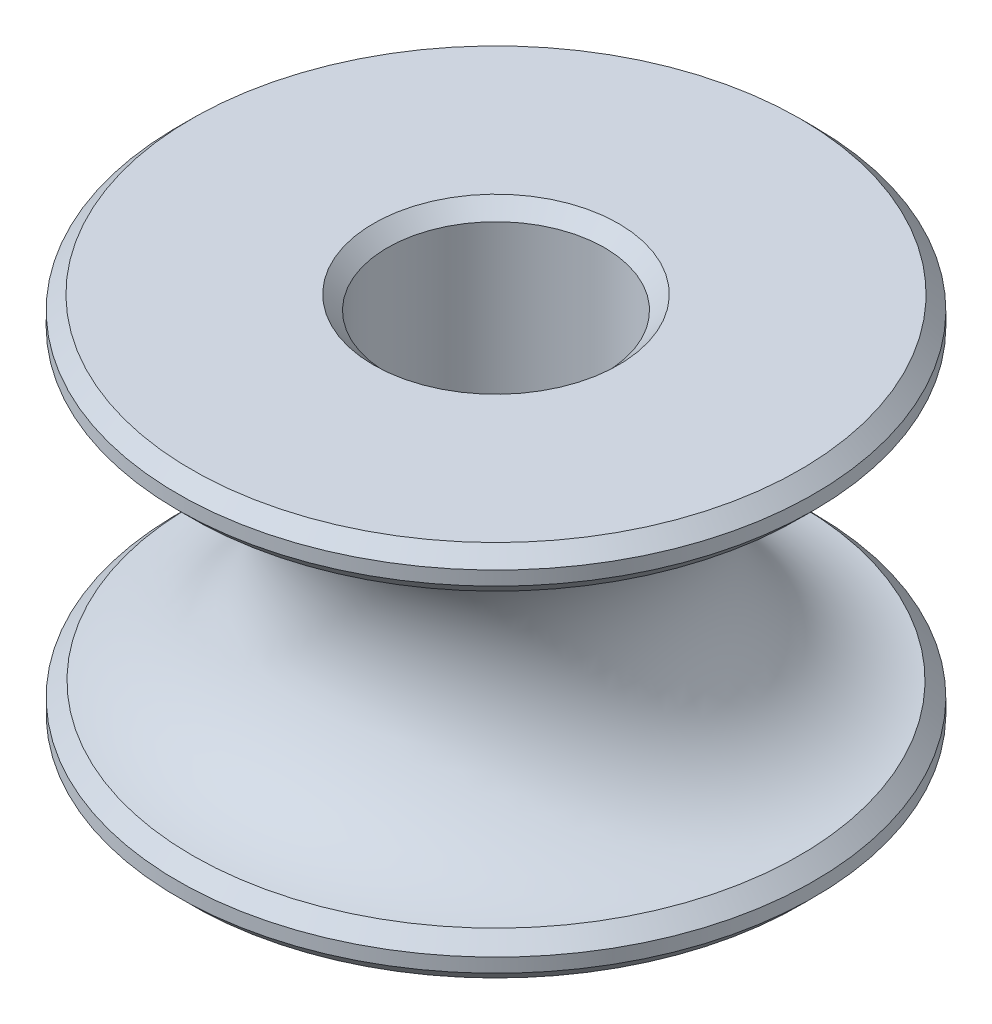
ISO-10303-21;
HEADER;
FILE_DESCRIPTION(('STEP AP214'),'2;1');
FILE_NAME('part.step','',(''),(''),'','','');
FILE_SCHEMA(('AUTOMOTIVE_DESIGN { 1 0 10303 214 1 1 1 1 }'));
ENDSEC;
DATA;
#1=APPLICATION_CONTEXT('core data for automotive mechanical design processes');
#2=APPLICATION_PROTOCOL_DEFINITION('international standard','automotive_design',2000,#1);
#3=PRODUCT_CONTEXT('',#1,'mechanical');
#4=PRODUCT('Part','Part','',(#3));
#5=PRODUCT_RELATED_PRODUCT_CATEGORY('part','',(#4));
#6=PRODUCT_DEFINITION_FORMATION('','',#4);
#7=PRODUCT_DEFINITION_CONTEXT('part definition',#1,'design');
#8=PRODUCT_DEFINITION('design','',#6,#7);
#9=PRODUCT_DEFINITION_SHAPE('','',#8);
#10=(LENGTH_UNIT() NAMED_UNIT(*) SI_UNIT(.MILLI.,.METRE.));
#11=(NAMED_UNIT(*) PLANE_ANGLE_UNIT() SI_UNIT($,.RADIAN.));
#12=(NAMED_UNIT(*) SI_UNIT($,.STERADIAN.) SOLID_ANGLE_UNIT());
#13=UNCERTAINTY_MEASURE_WITH_UNIT(LENGTH_MEASURE(1.E-05),#10,'distance_accuracy_value','');
#14=(GEOMETRIC_REPRESENTATION_CONTEXT(3) GLOBAL_UNCERTAINTY_ASSIGNED_CONTEXT((#13)) GLOBAL_UNIT_ASSIGNED_CONTEXT((#10,
#11,#12)) REPRESENTATION_CONTEXT('',''));
#15=CARTESIAN_POINT('',(0.,0.,0.));
#16=DIRECTION('',(0.,0.,1.));
#17=DIRECTION('',(1.,0.,0.));
#18=AXIS2_PLACEMENT_3D('',#15,#16,#17);
#19=CARTESIAN_POINT('',(0.,13.5,0.));
#20=DIRECTION('',(0.,-1.,0.));
#21=DIRECTION('',(0.,0.,-1.));
#22=AXIS2_PLACEMENT_3D('',#19,#20,#21);
#23=TOROIDAL_SURFACE('',#22,22.775,10.5);
#24=CARTESIAN_POINT('',(0.,3.05292644298629,0.));
#25=DIRECTION('',(0.,1.,0.));
#26=DIRECTION('',(0.,0.,1.));
#27=AXIS2_PLACEMENT_3D('',#24,#25,#26);
#28=CIRCLE('',#27,21.722073557014);
#29=CARTESIAN_POINT('',(0.,3.05292644298629,21.722073557014));
#30=VERTEX_POINT('',#29);
#31=EDGE_CURVE('E55',#30,#30,#28,.T.);
#32=ORIENTED_EDGE('',*,*,#31,.T.);
#33=EDGE_LOOP('',(#32));
#34=FACE_BOUND('',#33,.T.);
#35=CARTESIAN_POINT('',(0.,23.9470735570148,0.));
#36=DIRECTION('',(0.,-1.,0.));
#37=DIRECTION('',(0.,0.,-1.));
#38=AXIS2_PLACEMENT_3D('',#35,#36,#37);
#39=CIRCLE('',#38,21.7220735570139);
#40=CARTESIAN_POINT('',(0.,23.9470735570148,-21.7220735570139));
#41=VERTEX_POINT('',#40);
#42=EDGE_CURVE('E60',#41,#41,#39,.T.);
#43=ORIENTED_EDGE('',*,*,#42,.T.);
#44=EDGE_LOOP('',(#43));
#45=FACE_BOUND('',#44,.T.);
#46=ADVANCED_FACE('F41',(#34,#45),#23,.F.);
#47=CARTESIAN_POINT('',(0.,0.,0.));
#48=DIRECTION('',(0.,-1.,0.));
#49=DIRECTION('',(0.,0.,-1.));
#50=AXIS2_PLACEMENT_3D('',#47,#48,#49);
#51=CYLINDRICAL_SURFACE('',#50,22.775);
#52=CARTESIAN_POINT('',(0.,25.,0.));
#53=DIRECTION('',(0.,1.,0.));
#54=DIRECTION('',(0.,0.,1.));
#55=AXIS2_PLACEMENT_3D('',#52,#53,#54);
#56=CIRCLE('',#55,22.775);
#57=CARTESIAN_POINT('',(0.,25.,22.775));
#58=VERTEX_POINT('',#57);
#59=EDGE_CURVE('E10',#58,#58,#56,.T.);
#60=ORIENTED_EDGE('',*,*,#59,.T.);
#61=EDGE_LOOP('',(#60));
#62=FACE_BOUND('',#61,.T.);
#63=CARTESIAN_POINT('',(0.,26.,0.));
#64=DIRECTION('',(0.,-1.,0.));
#65=DIRECTION('',(0.,0.,-1.));
#66=AXIS2_PLACEMENT_3D('',#63,#64,#65);
#67=CIRCLE('',#66,22.775);
#68=CARTESIAN_POINT('',(0.,26.,-22.775));
#69=VERTEX_POINT('',#68);
#70=EDGE_CURVE('E50',#69,#69,#67,.T.);
#71=ORIENTED_EDGE('',*,*,#70,.T.);
#72=EDGE_LOOP('',(#71));
#73=FACE_BOUND('',#72,.T.);
#74=ADVANCED_FACE('F110',(#62,#73),#51,.T.);
#75=CARTESIAN_POINT('',(0.,27.,0.));
#76=DIRECTION('',(0.,-1.,0.));
#77=DIRECTION('',(0.,0.,-1.));
#78=AXIS2_PLACEMENT_3D('',#75,#76,#77);
#79=PLANE('',#78);
#80=CARTESIAN_POINT('',(0.,27.,0.));
#81=DIRECTION('',(0.,-1.,0.));
#82=DIRECTION('',(0.,0.,-1.));
#83=AXIS2_PLACEMENT_3D('',#80,#81,#82);
#84=CIRCLE('',#83,8.775);
#85=CARTESIAN_POINT('',(0.,27.,-8.775));
#86=VERTEX_POINT('',#85);
#87=EDGE_CURVE('E90',#86,#86,#84,.T.);
#88=ORIENTED_EDGE('',*,*,#87,.T.);
#89=EDGE_LOOP('',(#88));
#90=FACE_BOUND('',#89,.T.);
#91=CARTESIAN_POINT('',(0.,27.,0.));
#92=DIRECTION('',(0.,-1.,0.));
#93=DIRECTION('',(0.,0.,-1.));
#94=AXIS2_PLACEMENT_3D('',#91,#92,#93);
#95=CIRCLE('',#94,21.775);
#96=CARTESIAN_POINT('',(0.,27.,-21.775));
#97=VERTEX_POINT('',#96);
#98=EDGE_CURVE('E94',#97,#97,#95,.F.);
#99=ORIENTED_EDGE('',*,*,#98,.T.);
#100=EDGE_LOOP('',(#99));
#101=FACE_BOUND('',#100,.T.);
#102=ADVANCED_FACE('F99',(#90,#101),#79,.F.);
#103=CARTESIAN_POINT('',(0.,0.,0.));
#104=DIRECTION('',(0.,-1.,0.));
#105=DIRECTION('',(0.,0.,-1.));
#106=AXIS2_PLACEMENT_3D('',#103,#104,#105);
#107=CYLINDRICAL_SURFACE('',#106,7.775);
#108=CARTESIAN_POINT('',(0.,26.,0.));
#109=DIRECTION('',(0.,-1.,0.));
#110=DIRECTION('',(0.,0.,-1.));
#111=AXIS2_PLACEMENT_3D('',#108,#109,#110);
#112=CIRCLE('',#111,7.775);
#113=CARTESIAN_POINT('',(0.,26.,-7.775));
#114=VERTEX_POINT('',#113);
#115=EDGE_CURVE('E82',#114,#114,#112,.F.);
#116=ORIENTED_EDGE('',*,*,#115,.T.);
#117=EDGE_LOOP('',(#116));
#118=FACE_BOUND('',#117,.T.);
#119=CARTESIAN_POINT('',(0.,1.,0.));
#120=DIRECTION('',(0.,-1.,0.));
#121=DIRECTION('',(0.,0.,-1.));
#122=AXIS2_PLACEMENT_3D('',#119,#120,#121);
#123=CIRCLE('',#122,7.775);
#124=CARTESIAN_POINT('',(0.,1.,-7.775));
#125=VERTEX_POINT('',#124);
#126=EDGE_CURVE('E86',#125,#125,#123,.T.);
#127=ORIENTED_EDGE('',*,*,#126,.T.);
#128=EDGE_LOOP('',(#127));
#129=FACE_BOUND('',#128,.T.);
#130=ADVANCED_FACE('F165',(#118,#129),#107,.F.);
#131=CARTESIAN_POINT('',(0.,0.,0.));
#132=DIRECTION('',(0.,-1.,0.));
#133=DIRECTION('',(0.,0.,-1.));
#134=AXIS2_PLACEMENT_3D('',#131,#132,#133);
#135=PLANE('',#134);
#136=CARTESIAN_POINT('',(0.,0.,0.));
#137=DIRECTION('',(0.,-1.,0.));
#138=DIRECTION('',(0.,0.,-1.));
#139=AXIS2_PLACEMENT_3D('',#136,#137,#138);
#140=CIRCLE('',#139,8.77500000000001);
#141=CARTESIAN_POINT('',(0.,0.,-8.77500000000001));
#142=VERTEX_POINT('',#141);
#143=EDGE_CURVE('E74',#142,#142,#140,.F.);
#144=ORIENTED_EDGE('',*,*,#143,.T.);
#145=EDGE_LOOP('',(#144));
#146=FACE_BOUND('',#145,.T.);
#147=CARTESIAN_POINT('',(0.,0.,0.));
#148=DIRECTION('',(0.,-1.,0.));
#149=DIRECTION('',(0.,0.,-1.));
#150=AXIS2_PLACEMENT_3D('',#147,#148,#149);
#151=CIRCLE('',#150,21.775);
#152=CARTESIAN_POINT('',(0.,0.,-21.775));
#153=VERTEX_POINT('',#152);
#154=EDGE_CURVE('E78',#153,#153,#151,.T.);
#155=ORIENTED_EDGE('',*,*,#154,.T.);
#156=EDGE_LOOP('',(#155));
#157=FACE_BOUND('',#156,.T.);
#158=ADVANCED_FACE('F159',(#146,#157),#135,.T.);
#159=CARTESIAN_POINT('',(0.,0.,0.));
#160=DIRECTION('',(0.,-1.,0.));
#161=DIRECTION('',(0.,0.,-1.));
#162=AXIS2_PLACEMENT_3D('',#159,#160,#161);
#163=CYLINDRICAL_SURFACE('',#162,22.775);
#164=CARTESIAN_POINT('',(0.,1.,0.));
#165=DIRECTION('',(0.,-1.,0.));
#166=DIRECTION('',(0.,0.,-1.));
#167=AXIS2_PLACEMENT_3D('',#164,#165,#166);
#168=CIRCLE('',#167,22.775);
#169=CARTESIAN_POINT('',(0.,1.,-22.775));
#170=VERTEX_POINT('',#169);
#171=EDGE_CURVE('E66',#170,#170,#168,.F.);
#172=ORIENTED_EDGE('',*,*,#171,.T.);
#173=EDGE_LOOP('',(#172));
#174=FACE_BOUND('',#173,.T.);
#175=CARTESIAN_POINT('',(0.,1.99999999999999,0.));
#176=DIRECTION('',(0.,-1.,0.));
#177=DIRECTION('',(0.,0.,-1.));
#178=AXIS2_PLACEMENT_3D('',#175,#176,#177);
#179=CIRCLE('',#178,22.775);
#180=CARTESIAN_POINT('',(0.,1.99999999999999,-22.775));
#181=VERTEX_POINT('',#180);
#182=EDGE_CURVE('E70',#181,#181,#179,.T.);
#183=ORIENTED_EDGE('',*,*,#182,.T.);
#184=EDGE_LOOP('',(#183));
#185=FACE_BOUND('',#184,.T.);
#186=ADVANCED_FACE('F128',(#174,#185),#163,.T.);
#187=CARTESIAN_POINT('',(0.,27.,0.));
#188=DIRECTION('',(0.,1.,0.));
#189=DIRECTION('',(0.,0.,1.));
#190=AXIS2_PLACEMENT_3D('',#187,#188,#189);
#191=CONICAL_SURFACE('',#190,8.775,0.785398163397448);
#192=ORIENTED_EDGE('',*,*,#115,.F.);
#193=EDGE_LOOP('',(#192));
#194=FACE_BOUND('',#193,.T.);
#195=ORIENTED_EDGE('',*,*,#87,.F.);
#196=EDGE_LOOP('',(#195));
#197=FACE_BOUND('',#196,.T.);
#198=ADVANCED_FACE('F121',(#194,#197),#191,.F.);
#199=CARTESIAN_POINT('',(0.,1.,0.));
#200=DIRECTION('',(0.,-1.,0.));
#201=DIRECTION('',(0.,0.,-1.));
#202=AXIS2_PLACEMENT_3D('',#199,#200,#201);
#203=CONICAL_SURFACE('',#202,7.775,0.785398163397452);
#204=ORIENTED_EDGE('',*,*,#143,.F.);
#205=EDGE_LOOP('',(#204));
#206=FACE_BOUND('',#205,.T.);
#207=ORIENTED_EDGE('',*,*,#126,.F.);
#208=EDGE_LOOP('',(#207));
#209=FACE_BOUND('',#208,.T.);
#210=ADVANCED_FACE('F127',(#206,#209),#203,.F.);
#211=CARTESIAN_POINT('',(0.,0.,0.));
#212=DIRECTION('',(0.,1.,0.));
#213=DIRECTION('',(0.,0.,1.));
#214=AXIS2_PLACEMENT_3D('',#211,#212,#213);
#215=CONICAL_SURFACE('',#214,21.775,0.785398163397443);
#216=ORIENTED_EDGE('',*,*,#171,.F.);
#217=EDGE_LOOP('',(#216));
#218=FACE_BOUND('',#217,.T.);
#219=ORIENTED_EDGE('',*,*,#154,.F.);
#220=EDGE_LOOP('',(#219));
#221=FACE_BOUND('',#220,.T.);
#222=ADVANCED_FACE('F135',(#218,#221),#215,.T.);
#223=CARTESIAN_POINT('',(0.,1.99999999999999,0.));
#224=DIRECTION('',(0.,-1.,0.));
#225=DIRECTION('',(0.,0.,-1.));
#226=AXIS2_PLACEMENT_3D('',#223,#224,#225);
#227=CONICAL_SURFACE('',#226,22.775,0.785398163397449);
#228=ORIENTED_EDGE('',*,*,#31,.F.);
#229=EDGE_LOOP('',(#228));
#230=FACE_BOUND('',#229,.T.);
#231=ORIENTED_EDGE('',*,*,#182,.F.);
#232=EDGE_LOOP('',(#231));
#233=FACE_BOUND('',#232,.T.);
#234=ADVANCED_FACE('F107',(#230,#233),#227,.T.);
#235=CARTESIAN_POINT('',(0.,23.947073557014,0.));
#236=DIRECTION('',(0.,1.,0.));
#237=DIRECTION('',(0.,0.,1.));
#238=AXIS2_PLACEMENT_3D('',#235,#236,#237);
#239=CONICAL_SURFACE('',#238,21.722073557014,0.785398163397448);
#240=ORIENTED_EDGE('',*,*,#59,.F.);
#241=EDGE_LOOP('',(#240));
#242=FACE_BOUND('',#241,.T.);
#243=ORIENTED_EDGE('',*,*,#42,.F.);
#244=EDGE_LOOP('',(#243));
#245=FACE_BOUND('',#244,.T.);
#246=ADVANCED_FACE('F103',(#242,#245),#239,.T.);
#247=CARTESIAN_POINT('',(0.,26.,0.));
#248=DIRECTION('',(0.,-1.,0.));
#249=DIRECTION('',(0.,0.,-1.));
#250=AXIS2_PLACEMENT_3D('',#247,#248,#249);
#251=CONICAL_SURFACE('',#250,22.775,0.785398163397452);
#252=ORIENTED_EDGE('',*,*,#98,.F.);
#253=EDGE_LOOP('',(#252));
#254=FACE_BOUND('',#253,.T.);
#255=ORIENTED_EDGE('',*,*,#70,.F.);
#256=EDGE_LOOP('',(#255));
#257=FACE_BOUND('',#256,.T.);
#258=ADVANCED_FACE('F44',(#254,#257),#251,.T.);
#259=CLOSED_SHELL('',(#46,#74,#102,#130,#158,#186,#198,#210,#222,#234,#246,#258));
#260=MANIFOLD_SOLID_BREP('B2',#259);
#261=ADVANCED_BREP_SHAPE_REPRESENTATION('',(#18,#260),#14);
#262=SHAPE_DEFINITION_REPRESENTATION(#9,#261);
ENDSEC;
END-ISO-10303-21;
